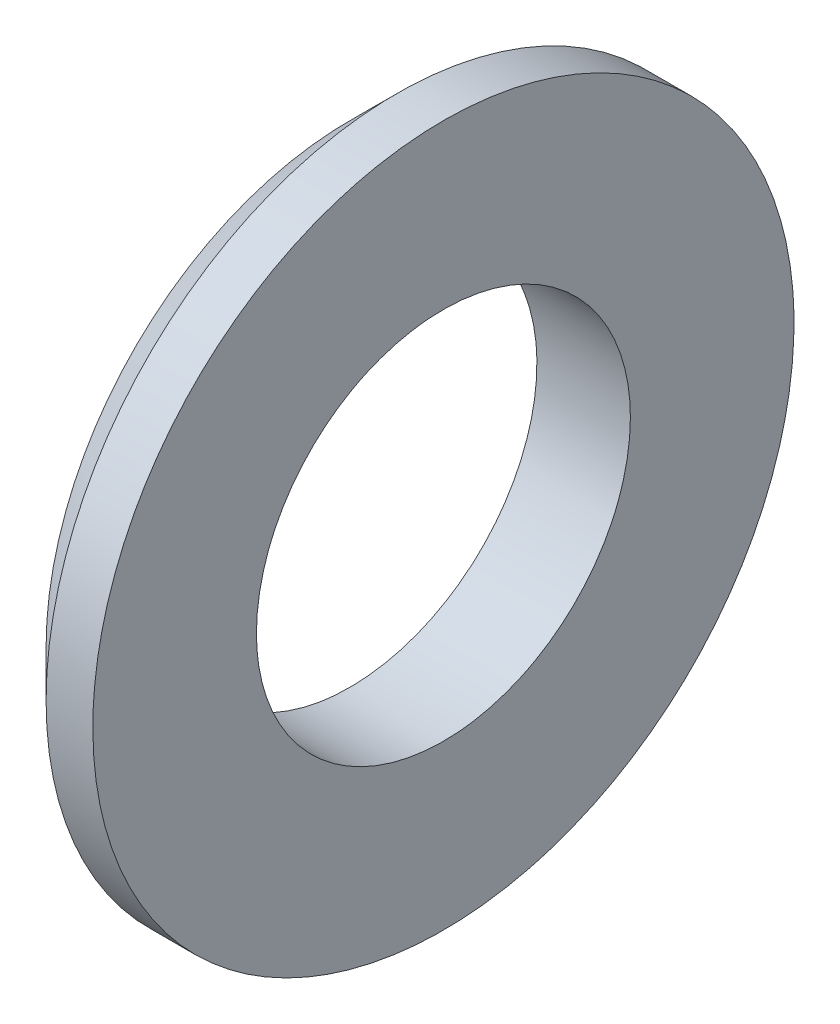
ISO-10303-21;
HEADER;
FILE_DESCRIPTION(('STEP AP214'),'2;1');
FILE_NAME('part.step','',(''),(''),'','','');
FILE_SCHEMA(('AUTOMOTIVE_DESIGN { 1 0 10303 214 1 1 1 1 }'));
ENDSEC;
DATA;
#1=APPLICATION_CONTEXT('core data for automotive mechanical design processes');
#2=APPLICATION_PROTOCOL_DEFINITION('international standard','automotive_design',2000,#1);
#3=PRODUCT_CONTEXT('',#1,'mechanical');
#4=PRODUCT('Part','Part','',(#3));
#5=PRODUCT_RELATED_PRODUCT_CATEGORY('part','',(#4));
#6=PRODUCT_DEFINITION_FORMATION('','',#4);
#7=PRODUCT_DEFINITION_CONTEXT('part definition',#1,'design');
#8=PRODUCT_DEFINITION('design','',#6,#7);
#9=PRODUCT_DEFINITION_SHAPE('','',#8);
#10=(LENGTH_UNIT() NAMED_UNIT(*) SI_UNIT(.MILLI.,.METRE.));
#11=(NAMED_UNIT(*) PLANE_ANGLE_UNIT() SI_UNIT($,.RADIAN.));
#12=(NAMED_UNIT(*) SI_UNIT($,.STERADIAN.) SOLID_ANGLE_UNIT());
#13=UNCERTAINTY_MEASURE_WITH_UNIT(LENGTH_MEASURE(1.E-05),#10,'distance_accuracy_value','');
#14=(GEOMETRIC_REPRESENTATION_CONTEXT(3) GLOBAL_UNCERTAINTY_ASSIGNED_CONTEXT((#13)) GLOBAL_UNIT_ASSIGNED_CONTEXT((#10,
#11,#12)) REPRESENTATION_CONTEXT('',''));
#15=CARTESIAN_POINT('',(0.,0.,0.));
#16=DIRECTION('',(0.,0.,1.));
#17=DIRECTION('',(1.,0.,0.));
#18=AXIS2_PLACEMENT_3D('',#15,#16,#17);
#19=CARTESIAN_POINT('',(0.,0.,5.2));
#20=CARTESIAN_POINT('',(0.8,0.,6.));
#21=(BOUNDED_CURVE() B_SPLINE_CURVE(1,(#19,#20),.UNSPECIFIED.,.F.,
.F.) B_SPLINE_CURVE_WITH_KNOTS((2,2),(0.,1.),
.UNSPECIFIED.) CURVE() GEOMETRIC_REPRESENTATION_ITEM() RATIONAL_B_SPLINE_CURVE((1.,1.)) REPRESENTATION_ITEM(''));
#22=CARTESIAN_POINT('',(-999.2,0.,0.));
#23=DIRECTION('',(1.,0.,0.));
#24=AXIS1_PLACEMENT('',#22,#23);
#25=SURFACE_OF_REVOLUTION('',#21,#24);
#26=CARTESIAN_POINT('',(0.800000000000023,0.,0.));
#27=DIRECTION('',(-1.,0.,0.));
#28=DIRECTION('',(0.,0.,1.));
#29=AXIS2_PLACEMENT_3D('',#26,#27,#28);
#30=CIRCLE('',#29,6.);
#31=CARTESIAN_POINT('',(0.8,0.,6.));
#32=VERTEX_POINT('',#31);
#33=EDGE_CURVE('E56',#32,#32,#30,.F.);
#34=ORIENTED_EDGE('',*,*,#33,.F.);
#35=EDGE_LOOP('',(#34));
#36=FACE_BOUND('',#35,.T.);
#37=CARTESIAN_POINT('',(0.,0.,0.));
#38=DIRECTION('',(-1.,0.,0.));
#39=DIRECTION('',(0.,0.,1.));
#40=AXIS2_PLACEMENT_3D('',#37,#38,#39);
#41=CIRCLE('',#40,5.2);
#42=CARTESIAN_POINT('',(0.,0.,5.2));
#43=VERTEX_POINT('',#42);
#44=EDGE_CURVE('E109',#43,#43,#41,.F.);
#45=ORIENTED_EDGE('',*,*,#44,.T.);
#46=EDGE_LOOP('',(#45));
#47=FACE_BOUND('',#46,.T.);
#48=ADVANCED_FACE('F51',(#36,#47),#25,.T.);
#49=CARTESIAN_POINT('',(0.8,0.,6.));
#50=CARTESIAN_POINT('',(1.6,0.,6.));
#51=(BOUNDED_CURVE() B_SPLINE_CURVE(1,(#49,#50),.UNSPECIFIED.,.F.,
.F.) B_SPLINE_CURVE_WITH_KNOTS((2,2),(0.,1.),
.UNSPECIFIED.) CURVE() GEOMETRIC_REPRESENTATION_ITEM() RATIONAL_B_SPLINE_CURVE((1.,1.)) REPRESENTATION_ITEM(''));
#52=CARTESIAN_POINT('',(0.,0.,0.));
#53=DIRECTION('',(1.,0.,0.));
#54=AXIS1_PLACEMENT('',#52,#53);
#55=SURFACE_OF_REVOLUTION('',#51,#54);
#56=ORIENTED_EDGE('',*,*,#33,.T.);
#57=EDGE_LOOP('',(#56));
#58=FACE_BOUND('',#57,.T.);
#59=CARTESIAN_POINT('',(1.6,-3.59170164361853E-10,6.));
#60=CARTESIAN_POINT('',(1.6,-0.26968095314783,5.99999418190786));
#61=CARTESIAN_POINT('',(1.6,-0.539478358188806,5.98178535260379));
#62=CARTESIAN_POINT('',(1.6,-1.07451641210655,5.90917848538037));
#63=CARTESIAN_POINT('',(1.6,-1.33975075115284,5.85473391311402));
#64=CARTESIAN_POINT('',(1.6,-1.76256270022421,5.73775804767826));
#65=CARTESIAN_POINT('',(1.6,-1.9231803274527,5.68593304659074));
#66=CARTESIAN_POINT('',(1.6,-2.2395305465287,5.56892537873634));
#67=CARTESIAN_POINT('',(1.6,-2.39526236335028,5.50374060496664));
#68=CARTESIAN_POINT('',(1.6,-2.7006886216708,5.36047973336366));
#69=CARTESIAN_POINT('',(1.6,-2.85038251993142,5.28240247878424));
#70=CARTESIAN_POINT('',(1.6,-3.14271531515376,5.11388427856295));
#71=CARTESIAN_POINT('',(1.6,-3.28535165406967,5.02343889409568));
#72=CARTESIAN_POINT('',(1.6,-3.5624252446705,4.83089779344028));
#73=CARTESIAN_POINT('',(1.6,-3.69686654902699,4.72880790868914));
#74=CARTESIAN_POINT('',(1.6,-3.95672043816997,4.51362717266514));
#75=CARTESIAN_POINT('',(1.6,-4.08212967746626,4.40053228121846));
#76=CARTESIAN_POINT('',(1.6,-4.32291860112681,4.16423061334616));
#77=CARTESIAN_POINT('',(1.6,-4.43830275316045,4.04102838933053));
#78=CARTESIAN_POINT('',(1.6,-4.65832524504454,3.78529635898459));
#79=CARTESIAN_POINT('',(1.6,-4.7629596026545,3.6527631264218));
#80=CARTESIAN_POINT('',(1.6,-4.9606564214362,3.37939809323381));
#81=CARTESIAN_POINT('',(1.6,-5.05372276479612,3.23856910015163));
#82=CARTESIAN_POINT('',(1.6,-5.22769542700006,2.94951945522944));
#83=CARTESIAN_POINT('',(1.6,-5.30859724340712,2.80129609342423));
#84=CARTESIAN_POINT('',(1.6,-5.45759781399371,2.49861371614285));
#85=CARTESIAN_POINT('',(1.6,-5.52570110273952,2.34415693284182));
#86=CARTESIAN_POINT('',(1.6,-5.64867893546045,2.02999793018249));
#87=CARTESIAN_POINT('',(1.6,-5.70354858275821,1.87029379397168));
#88=CARTESIAN_POINT('',(1.6,-5.79961812957173,1.54689153790312));
#89=CARTESIAN_POINT('',(1.6,-5.84082319549598,1.3831949527292));
#90=CARTESIAN_POINT('',(1.6,-5.90931213289774,1.05285097630758));
#91=CARTESIAN_POINT('',(1.6,-5.93659078832452,0.886202503593339));
#92=CARTESIAN_POINT('',(1.6,-5.97700124271102,0.551269208436597));
#93=CARTESIAN_POINT('',(1.6,-5.99013889630438,0.38298509232115));
#94=CARTESIAN_POINT('',(1.6,-6.00219682526369,0.0458318231667442));
#95=CARTESIAN_POINT('',(1.6,-6.00111065533081,-0.12303756042529));
#96=CARTESIAN_POINT('',(1.6,-5.98471302840039,-0.460083887052308));
#97=CARTESIAN_POINT('',(1.6,-5.96940160225738,-0.628260831588397));
#98=CARTESIAN_POINT('',(1.6,-5.92467258235549,-0.962650635694363));
#99=CARTESIAN_POINT('',(1.6,-5.89526138105391,-1.1288643503834));
#100=CARTESIAN_POINT('',(1.6,-5.82252919483873,-1.45829316791027));
#101=CARTESIAN_POINT('',(1.6,-5.77920239125474,-1.62150698613563));
#102=CARTESIAN_POINT('',(1.6,-5.67896954305696,-1.94364321093796));
#103=CARTESIAN_POINT('',(1.6,-5.62206858479042,-2.10256720017881));
#104=CARTESIAN_POINT('',(1.6,-5.49505796725162,-2.41511995480573));
#105=CARTESIAN_POINT('',(1.6,-5.42494307752962,-2.56874659476722));
#106=CARTESIAN_POINT('',(1.6,-5.27204633829621,-2.86949001663107));
#107=CARTESIAN_POINT('',(1.6,-5.18926917669415,-3.01660918189265));
#108=CARTESIAN_POINT('',(1.6,-5.01158927766852,-3.30339768494254));
#109=CARTESIAN_POINT('',(1.6,-4.91668273121635,-3.44306466288303));
#110=CARTESIAN_POINT('',(1.6,-4.71547660508139,-3.71385552138702));
#111=CARTESIAN_POINT('',(1.6,-4.6091812439159,-3.84498253648888));
#112=CARTESIAN_POINT('',(1.6,-4.38589737351381,-4.09784823521063));
#113=CARTESIAN_POINT('',(1.6,-4.26890631606382,-4.21958466875232));
#114=CARTESIAN_POINT('',(1.6,-4.02512952864556,-4.45272583136818));
#115=CARTESIAN_POINT('',(1.6,-3.89834742788019,-4.56413435526958));
#116=CARTESIAN_POINT('',(1.6,-3.63576155073899,-4.77595139976924));
#117=CARTESIAN_POINT('',(1.6,-3.49995166190058,-4.87635234304189));
#118=CARTESIAN_POINT('',(1.6,-3.22040576804697,-5.06531733652102));
#119=CARTESIAN_POINT('',(1.6,-3.07667270372441,-5.15388573715342));
#120=CARTESIAN_POINT('',(1.6,-2.78211786340608,-5.31867713519572));
#121=CARTESIAN_POINT('',(1.6,-2.63128955109556,-5.39488844979913));
#122=CARTESIAN_POINT('',(1.6,-2.32380096382398,-5.53429624040361));
#123=CARTESIAN_POINT('',(1.6,-2.16714286003786,-5.59749750554603));
#124=CARTESIAN_POINT('',(1.6,-1.84923084035951,-5.71040868151002));
#125=CARTESIAN_POINT('',(1.6,-1.68798215433273,-5.76013331557612));
#126=CARTESIAN_POINT('',(1.6,-1.36193075528332,-5.84581478206233));
#127=CARTESIAN_POINT('',(1.6,-1.19712930608762,-5.88177642773795));
#128=CARTESIAN_POINT('',(1.6,-0.860929769514175,-5.94042345690064));
#129=CARTESIAN_POINT('',(1.6,-0.689469698420019,-5.9627550902537));
#130=CARTESIAN_POINT('',(1.6,-0.345355347366082,-5.99254235955611));
#131=CARTESIAN_POINT('',(1.6,-0.17270155315804,-6.00000372580268));
#132=CARTESIAN_POINT('',(1.6,0.26968095114671,-5.99999418199774));
#133=CARTESIAN_POINT('',(1.6,0.539478356193441,-5.9817853527837));
#134=CARTESIAN_POINT('',(1.6,1.07451641013565,-5.90917848573881));
#135=CARTESIAN_POINT('',(1.6,1.33975074920065,-5.85473391356078));
#136=CARTESIAN_POINT('',(1.6,1.7625626983117,-5.73775804826575));
#137=CARTESIAN_POINT('',(1.6,1.92318032555757,-5.68593304723174));
#138=CARTESIAN_POINT('',(1.6,2.23953054467277,-5.56892537948271));
#139=CARTESIAN_POINT('',(1.6,2.39526236151617,-5.50374060576486));
#140=CARTESIAN_POINT('',(1.6,2.70068861988443,-5.36047973426366));
#141=CARTESIAN_POINT('',(1.6,2.85038251817098,-5.28240247973417));
#142=CARTESIAN_POINT('',(1.6,3.14271531344931,-5.11388427961041));
#143=CARTESIAN_POINT('',(1.6,3.28535165239528,-5.02343889519074));
#144=CARTESIAN_POINT('',(1.6,3.56242524306018,-4.83089779462776));
#145=CARTESIAN_POINT('',(1.6,3.69686654745069,-4.72880790992145));
#146=CARTESIAN_POINT('',(1.6,3.95672043666537,-4.5136271739841));
#147=CARTESIAN_POINT('',(1.6,4.08212967599935,-4.40053228257924));
#148=CARTESIAN_POINT('',(1.6,4.32291859973867,-4.16423061478721));
#149=CARTESIAN_POINT('',(1.6,4.43830275181339,-4.04102839081003));
#150=CARTESIAN_POINT('',(1.6,4.65832524378275,-3.78529636053739));
#151=CARTESIAN_POINT('',(1.6,4.7629596014369,-3.65276312800947));
#152=CARTESIAN_POINT('',(1.6,4.96065642030974,-3.37939809488736));
#153=CARTESIAN_POINT('',(1.6,5.0537227637166,-3.2385691018362));
#154=CARTESIAN_POINT('',(1.6,5.2276954260169,-2.949519456972));
#155=CARTESIAN_POINT('',(1.6,5.30859724247336,-2.80129609519375));
#156=CARTESIAN_POINT('',(1.6,5.45759781316085,-2.49861371796204));
#157=CARTESIAN_POINT('',(1.6,5.52570110195814,-2.34415693468371));
#158=CARTESIAN_POINT('',(1.6,5.64867893478379,-2.02999793206538));
#159=CARTESIAN_POINT('',(1.6,5.70354858213478,-1.87029379587285));
#160=CARTESIAN_POINT('',(1.6,5.7996181290561,-1.54689153983632));
#161=CARTESIAN_POINT('',(1.6,5.84082319503491,-1.38319495467614));
#162=CARTESIAN_POINT('',(1.6,5.90931213254679,-1.05285097827735));
#163=CARTESIAN_POINT('',(1.6,5.93659078802911,-0.8862025055722));
#164=CARTESIAN_POINT('',(1.6,5.97700124252726,-0.551269210428928));
#165=CARTESIAN_POINT('',(1.6,5.99013889617672,-0.38298509431786));
#166=CARTESIAN_POINT('',(1.6,6.00219682524842,-0.0458318251674741));
#167=CARTESIAN_POINT('',(1.6,6.00111065537183,0.123037558424922));
#168=CARTESIAN_POINT('',(1.6,5.98471302855375,0.46008388505741));
#169=CARTESIAN_POINT('',(1.6,5.9694016024668,0.628260829598606));
#170=CARTESIAN_POINT('',(1.6,5.92467258267637,0.962650633719489));
#171=CARTESIAN_POINT('',(1.6,5.89526138143019,1.12886434841833));
#172=CARTESIAN_POINT('',(1.6,5.82252919532482,1.45829316596945));
#173=CARTESIAN_POINT('',(1.6,5.77920239179524,1.62150698420925));
#174=CARTESIAN_POINT('',(1.6,5.67896954370484,1.94364320904498));
#175=CARTESIAN_POINT('',(1.6,5.62206858549127,2.1025671983048));
#176=CARTESIAN_POINT('',(1.6,5.49505796805666,2.41511995297403));
#177=CARTESIAN_POINT('',(1.6,5.42494307838588,2.56874659295886));
#178=CARTESIAN_POINT('',(1.6,5.27204633925275,2.86949001487365));
#179=CARTESIAN_POINT('',(1.6,5.18926917769974,3.0166091801628));
#180=CARTESIAN_POINT('',(1.6,5.01158927876972,3.30339768327192));
#181=CARTESIAN_POINT('',(1.6,4.91668273236409,3.44306466124407));
#182=CARTESIAN_POINT('',(1.6,4.71547660631937,3.71385551981516));
#183=CARTESIAN_POINT('',(1.6,4.60918124519757,3.84498253495247));
#184=CARTESIAN_POINT('',(1.6,4.38589737487967,4.09784823374876));
#185=CARTESIAN_POINT('',(1.6,4.26890631747017,4.21958466732953));
#186=CARTESIAN_POINT('',(1.6,4.02512953012944,4.45272583002681));
#187=CARTESIAN_POINT('',(1.6,3.89834742940111,4.56413435397053));
#188=CARTESIAN_POINT('',(1.6,3.63576155233049,4.77595139855768));
#189=CARTESIAN_POINT('',(1.6,3.49995166352564,4.87635234187552));
#190=CARTESIAN_POINT('',(1.6,3.2204057697352,5.06531733544768));
#191=CARTESIAN_POINT('',(1.6,3.07667270544227,5.15388573612792));
#192=CARTESIAN_POINT('',(1.6,2.78211786517943,5.31867713426809));
#193=CARTESIAN_POINT('',(1.6,2.6312895528948,5.39488844892156));
#194=CARTESIAN_POINT('',(1.6,2.32380096567069,5.53429623962818));
#195=CARTESIAN_POINT('',(1.6,2.16714286190615,5.59749750482269));
#196=CARTESIAN_POINT('',(1.6,1.84923084226558,5.71040868089278));
#197=CARTESIAN_POINT('',(1.6,1.68798215625497,5.76013331501281));
#198=CARTESIAN_POINT('',(1.6,1.36193075723323,5.84581478160808));
#199=CARTESIAN_POINT('',(1.6,1.19712930804903,5.88177642733878));
#200=CARTESIAN_POINT('',(1.6,0.860929770837556,5.94042345672821));
#201=CARTESIAN_POINT('',(1.6,0.689469699083808,5.96275509019626));
#202=CARTESIAN_POINT('',(1.6,0.345355346701393,5.99254235961364));
#203=CARTESIAN_POINT('',(1.6,0.172701551824469,6.00000372586025));
#204=CARTESIAN_POINT('',(1.6,-3.59170164361853E-10,6.));
#205=B_SPLINE_CURVE_WITH_KNOTS('',3,(#59,#60,#61,#62,#63,#64,#65,#66,#67,#68,#69,#70,#71,#72,
#73,#74,#75,#76,#77,#78,#79,#80,#81,#82,#83,#84,#85,#86,#87,#88,#89,#90,#91,#92,#93,#94,#95,#96,
#97,#98,#99,#100,#101,#102,#103,#104,#105,#106,#107,#108,#109,#110,#111,#112,#113,#114,#115,
#116,#117,#118,#119,#120,#121,#122,#123,#124,#125,#126,#127,#128,#129,#130,#131,#132,#133,#134,
#135,#136,#137,#138,#139,#140,#141,#142,#143,#144,#145,#146,#147,#148,#149,#150,#151,#152,#153,
#154,#155,#156,#157,#158,#159,#160,#161,#162,#163,#164,#165,#166,#167,#168,#169,#170,#171,#172,
#173,#174,#175,#176,#177,#178,#179,#180,#181,#182,#183,#184,#185,#186,#187,#188,#189,#190,#191,
#192,#193,#194,#195,#196,#197,#198,#199,#200,#201,#202,#203,#204),.UNSPECIFIED.,.T.,.F.,(4,2,2,
2,2,2,2,2,2,2,2,2,2,2,2,2,2,2,2,2,2,2,2,2,2,2,2,2,2,2,2,2,2,2,2,2,2,2,2,2,2,2,2,2,2,2,2,2,2,2,2,
2,2,2,2,2,2,2,2,2,2,2,2,2,2,2,2,2,2,2,2,2,4),(0.,0.808663640157875,1.618367784214,
2.12414327508747,2.62999859453184,3.13589932528701,3.64198209872925,4.14781253513256,
4.65382937841629,5.15961954662002,5.66559641326993,6.17140301461206,6.67739637092618,
7.18321011250801,7.68921072781318,8.19501981187124,8.70101820485431,9.20680702456421,
9.71282504234017,10.2188419625669,10.7246296850336,11.2306291735367,11.7364393568672,
12.242450176369,12.7482741086235,13.2542572784614,13.7600536714091,14.2659708842363,
14.7717014628101,15.2777780155255,15.7836679859079,16.2900334875426,16.7962122558571,
17.3018357731367,17.8072822994983,18.3253437807151,18.8432055869232,19.6518692270792,
20.4615733711372,20.967348862011,21.4732041814557,21.9791049122106,22.4851876856525,
22.9910181220557,23.4970349653394,24.0028251335432,24.5088020001932,25.0146086015353,
25.5206019578495,26.0264156994313,26.5324163147364,27.0382253987945,27.5442237917776,
28.0500126114875,28.5560306292634,29.0620475494902,29.5678352719569,30.07383476046,
30.5796449437904,31.0856557632922,31.5914796955466,32.0974628653845,32.6032592583324,
33.1091764711599,33.6149070497341,34.1209836024491,34.6268735728312,35.1332390744643,
35.6394178427772,36.145041360058,36.6504878864216,37.1685493696372,37.6864111778428),.UNSPECIFIED.);
#206=CARTESIAN_POINT('',(1.6,-3.59170164361853E-10,6.));
#207=VERTEX_POINT('',#206);
#208=EDGE_CURVE('E65',#207,#207,#205,.T.);
#209=ORIENTED_EDGE('',*,*,#208,.F.);
#210=EDGE_LOOP('',(#209));
#211=FACE_BOUND('',#210,.T.);
#212=ADVANCED_FACE('F86',(#58,#211),#55,.T.);
#213=CARTESIAN_POINT('',(0.,-5.2624,5.2624));
#214=DIRECTION('',(-1.,0.,0.));
#215=DIRECTION('',(0.,0.,-1.));
#216=AXIS2_PLACEMENT_3D('',#213,#214,#215);
#217=PLANE('',#216);
#218=CARTESIAN_POINT('',(0.,-1.91557420992988E-10,3.2));
#219=CARTESIAN_POINT('',(0.,-0.089845964986707,3.19999946157711));
#220=CARTESIAN_POINT('',(0.,-0.179708441404551,3.19621272757599));
#221=CARTESIAN_POINT('',(0.,-0.358812389552788,3.18109041069085));
#222=CARTESIAN_POINT('',(0.,-0.448053670081112,3.16975259915016));
#223=CARTESIAN_POINT('',(0.,-0.625414101327529,3.1395791364016));
#224=CARTESIAN_POINT('',(0.,-0.713531240540526,3.1207315832284));
#225=CARTESIAN_POINT('',(0.,-0.887913522848521,3.07566855660641));
#226=CARTESIAN_POINT('',(0.,-0.974177101632721,3.04944710404263));
#227=CARTESIAN_POINT('',(0.,-1.22889409111843,2.96008442313228));
#228=CARTESIAN_POINT('',(0.,-1.39370242213017,2.88617147047747));
#229=CARTESIAN_POINT('',(0.,-1.70855258164091,2.71168650303886));
#230=CARTESIAN_POINT('',(0.,-1.85859384850507,2.61111347483094));
#231=CARTESIAN_POINT('',(0.,-2.06932057923381,2.44254853488555));
#232=CARTESIAN_POINT('',(0.,-2.13721332378828,2.38336481773535));
#233=CARTESIAN_POINT('',(0.,-2.26772492966973,2.2595350313063));
#234=CARTESIAN_POINT('',(0.,-2.33034881270231,2.19489428357399));
#235=CARTESIAN_POINT('',(0.,-2.44995585090148,2.06053605003234));
#236=CARTESIAN_POINT('',(0.,-2.50693643801514,1.99081627776759));
#237=CARTESIAN_POINT('',(0.,-2.61482744355101,1.84683075488405));
#238=CARTESIAN_POINT('',(0.,-2.66573645299682,1.77256395510529));
#239=CARTESIAN_POINT('',(0.,-2.80875394640783,1.54375281459574));
#240=CARTESIAN_POINT('',(0.,-2.89127906356545,1.38305574192639));
#241=CARTESIAN_POINT('',(0.,-3.02812898167749,1.05017429095425));
#242=CARTESIAN_POINT('',(0.,-3.08245408382124,0.877990035362125));
#243=CARTESIAN_POINT('',(0.,-3.16144052373424,0.5269228194254));
#244=CARTESIAN_POINT('',(0.,-3.18610170308556,0.348039823311946));
#245=CARTESIAN_POINT('',(0.,-3.20503470734791,-0.0113272110865404));
#246=CARTESIAN_POINT('',(0.,-3.19930653225895,-0.191811249371573));
#247=CARTESIAN_POINT('',(0.,-3.15764643139749,-0.549234645069032));
#248=CARTESIAN_POINT('',(0.,-3.12171466692443,-0.726174021406227));
#249=CARTESIAN_POINT('',(0.,-3.02060050973804,-1.07159244550238));
#250=CARTESIAN_POINT('',(0.,-2.95541780460866,-1.24007140287806));
#251=CARTESIAN_POINT('',(0.,-2.83723482291628,-1.48264371020343));
#252=CARTESIAN_POINT('',(0.,-2.79441137092613,-1.56184874004235));
#253=CARTESIAN_POINT('',(0.,-2.70224720170133,-1.7163740317803));
#254=CARTESIAN_POINT('',(0.,-2.65290799588566,-1.79169518898031));
#255=CARTESIAN_POINT('',(0.,-2.54808104652755,-1.93787757230841));
#256=CARTESIAN_POINT('',(0.,-2.49259609707533,-2.00874080239109));
#257=CARTESIAN_POINT('',(0.,-2.37581864944673,-2.14559884198745));
#258=CARTESIAN_POINT('',(0.,-2.31452059819251,-2.21158888707976));
#259=CARTESIAN_POINT('',(0.,-2.12267272336283,-2.40136319236304));
#260=CARTESIAN_POINT('',(0.,-1.98402997958468,-2.51714533849441));
#261=CARTESIAN_POINT('',(0.,-1.68925715215087,-2.72374787239141));
#262=CARTESIAN_POINT('',(0.,-1.5331277335084,-2.81456920895607));
#263=CARTESIAN_POINT('',(0.,-1.28921079294775,-2.93020207443899));
#264=CARTESIAN_POINT('',(0.,-1.20618003199,-2.96534268248769));
#265=CARTESIAN_POINT('',(0.,-1.03749819990082,-3.02847980528005));
#266=CARTESIAN_POINT('',(0.,-0.951849312687562,-3.05648210166587));
#267=CARTESIAN_POINT('',(0.,-0.778641268240398,-3.10512502268191));
#268=CARTESIAN_POINT('',(0.,-0.69108536199849,-3.12577727202647));
#269=CARTESIAN_POINT('',(0.,-0.514561923876429,-3.15963557239238));
#270=CARTESIAN_POINT('',(0.,-0.425594816320349,-3.17284381964183));
#271=CARTESIAN_POINT('',(0.,-0.280408181089026,-3.18818539502755));
#272=CARTESIAN_POINT('',(0.,-0.224421107487565,-3.19261446982878));
#273=CARTESIAN_POINT('',(0.,-0.112291505803032,-3.19852194054856));
#274=CARTESIAN_POINT('',(0.,-0.0561489777199612,-3.20000033646712));
#275=CARTESIAN_POINT('',(0.,0.0898459639196159,-3.19999946160706));
#276=CARTESIAN_POINT('',(0.,0.179708440338472,-3.19621272763592));
#277=CARTESIAN_POINT('',(0.,0.358812388491312,-3.18109041081058));
#278=CARTESIAN_POINT('',(0.,0.448053669023225,-3.16975259929969));
#279=CARTESIAN_POINT('',(0.,0.625414100279794,-3.13957913661032));
#280=CARTESIAN_POINT('',(0.,0.713531239499351,-3.12073158346646));
#281=CARTESIAN_POINT('',(0.,0.887913521822863,-3.07566855690251));
#282=CARTESIAN_POINT('',(0.,0.974177100616024,-3.04944710436743));
#283=CARTESIAN_POINT('',(0.,1.22889409013172,-2.96008442354192));
#284=CARTESIAN_POINT('',(0.,1.3937024211681,-2.88617147094205));
#285=CARTESIAN_POINT('',(0.,1.708552580737,-2.71168650360839));
#286=CARTESIAN_POINT('',(0.,1.85859384763469,-2.61111347545048));
#287=CARTESIAN_POINT('',(0.,2.06932057841962,-2.44254853557533));
#288=CARTESIAN_POINT('',(0.,2.1372133229938,-2.38336481844777));
#289=CARTESIAN_POINT('',(0.,2.26772492891651,-2.25953503206225));
#290=CARTESIAN_POINT('',(0.,2.33034881197063,-2.19489428435083));
#291=CARTESIAN_POINT('',(0.,2.44995585021459,-2.06053605084905));
#292=CARTESIAN_POINT('',(0.,2.5069364373515,-1.99081627860328));
#293=CARTESIAN_POINT('',(0.,2.61482744293538,-1.84683075575569));
#294=CARTESIAN_POINT('',(0.,2.66573645240596,-1.77256395599388));
#295=CARTESIAN_POINT('',(0.,2.80875394589325,-1.54375281553199));
#296=CARTESIAN_POINT('',(0.,2.89127906310444,-1.38305574289014));
#297=CARTESIAN_POINT('',(0.,3.02812898132743,-1.05017429196362));
#298=CARTESIAN_POINT('',(0.,3.08245408352858,-0.877990036389604));
#299=CARTESIAN_POINT('',(0.,3.1614405235586,-0.526922820479214));
#300=CARTESIAN_POINT('',(0.,3.18610170296954,-0.348039824373981));
#301=CARTESIAN_POINT('',(0.,3.20503470735168,0.0113272100181944));
#302=CARTESIAN_POINT('',(0.,3.19930653232289,0.191811248305138));
#303=CARTESIAN_POINT('',(0.,3.15764643158057,0.549234644016491));
#304=CARTESIAN_POINT('',(0.,3.12171466716649,0.726174020365668));
#305=CARTESIAN_POINT('',(0.,3.02060051009523,1.07159244449552));
#306=CARTESIAN_POINT('',(0.,2.95541780502201,1.24007140189293));
#307=CARTESIAN_POINT('',(0.,2.8372348234105,1.48264370925768));
#308=CARTESIAN_POINT('',(0.,2.79441137144676,1.56184873911085));
#309=CARTESIAN_POINT('',(0.,2.70224720227348,1.71637403087951));
#310=CARTESIAN_POINT('',(0.,2.65290799648293,1.79169518809595));
#311=CARTESIAN_POINT('',(0.,2.54808104717355,1.93787757145899));
#312=CARTESIAN_POINT('',(0.,2.49259609774494,2.00874080156018));
#313=CARTESIAN_POINT('',(0.,2.37581865016195,2.14559884119549));
#314=CARTESIAN_POINT('',(0.,2.31452059892971,2.21158888630824));
#315=CARTESIAN_POINT('',(0.,2.12267272416329,2.40136319165548));
#316=CARTESIAN_POINT('',(0.,1.98402998042375,2.51714533783305));
#317=CARTESIAN_POINT('',(0.,1.6892571530588,2.72374787182831));
#318=CARTESIAN_POINT('',(0.,1.5331277344466,2.81456920844502));
#319=CARTESIAN_POINT('',(0.,1.28921079392468,2.93020207400916));
#320=CARTESIAN_POINT('',(0.,1.20618003297887,2.96534268208545));
#321=CARTESIAN_POINT('',(0.,1.03749820091122,3.0284798049339));
#322=CARTESIAN_POINT('',(0.,0.951849313707563,3.05648210134821));
#323=CARTESIAN_POINT('',(0.,0.778641269276715,3.10512502242205));
#324=CARTESIAN_POINT('',(0.,0.691085363041508,3.12577727179587));
#325=CARTESIAN_POINT('',(0.,0.514561924930307,3.15963557222076));
#326=CARTESIAN_POINT('',(0.,0.425594817378384,3.17284381949992));
#327=CARTESIAN_POINT('',(0.,0.280408181798157,3.18818539497145));
#328=CARTESIAN_POINT('',(0.,0.224421107842622,3.19261446981008));
#329=CARTESIAN_POINT('',(0.,0.112291505447973,3.19852194056727));
#330=CARTESIAN_POINT('',(0.,0.0561489770088588,3.20000033648583));
#331=CARTESIAN_POINT('',(0.,-1.91557420992988E-10,3.2));
#332=B_SPLINE_CURVE_WITH_KNOTS('',3,(#218,#219,#220,#221,#222,#223,#224,#225,#226,#227,#228,
#229,#230,#231,#232,#233,#234,#235,#236,#237,#238,#239,#240,#241,#242,#243,#244,#245,#246,#247,
#248,#249,#250,#251,#252,#253,#254,#255,#256,#257,#258,#259,#260,#261,#262,#263,#264,#265,#266,
#267,#268,#269,#270,#271,#272,#273,#274,#275,#276,#277,#278,#279,#280,#281,#282,#283,#284,#285,
#286,#287,#288,#289,#290,#291,#292,#293,#294,#295,#296,#297,#298,#299,#300,#301,#302,#303,#304,
#305,#306,#307,#308,#309,#310,#311,#312,#313,#314,#315,#316,#317,#318,#319,#320,#321,#322,#323,
#324,#325,#326,#327,#328,#329,#330,#331),.UNSPECIFIED.,.T.,.F.,(4,2,2,2,2,2,2,2,2,2,2,2,2,2,2,2,
2,2,2,2,2,2,2,2,2,2,2,2,2,2,2,2,2,2,2,2,2,2,2,2,2,2,2,2,2,2,2,2,2,2,2,2,2,2,2,2,4),(0.,
0.269486203930179,0.539051980415856,0.80904669391214,1.07926096659492,1.61840143244712,
2.15756239547763,2.42749612813386,2.69716960401562,2.96696523972049,3.23682336314686,
3.77597695685429,4.31512479203085,4.8542755064729,5.39342622091495,5.93257405609149,
6.47172764979894,6.74158577322535,7.01138140893026,7.28105488481198,7.55098861746817,
8.09014958049871,8.62929004635087,8.89950431903434,9.16949903253144,9.43906480901659,
9.7085510129458,9.87696563967945,10.0453802664131,10.3148664703423,10.5844322468275,
10.8544269603246,11.124641233008,11.6637816988602,12.2029426618907,12.4728763945469,
12.7425498704286,13.0123455061335,13.28220362956,13.8213572232674,14.3605050584439,
14.899655772886,15.438806487328,15.9779543225046,16.517107916212,16.7869660396384,
17.0567616753433,17.326435151225,17.5963688838813,18.1355298469118,18.674670312764,
18.9448845854468,19.214879298943,19.4844450754287,19.7539312793589,19.9223459071588,
20.0907605349588),.UNSPECIFIED.);
#333=CARTESIAN_POINT('',(0.,-1.91557420992988E-10,3.2));
#334=VERTEX_POINT('',#333);
#335=EDGE_CURVE('E60',#334,#334,#332,.T.);
#336=ORIENTED_EDGE('',*,*,#335,.T.);
#337=EDGE_LOOP('',(#336));
#338=FACE_BOUND('',#337,.T.);
#339=ORIENTED_EDGE('',*,*,#44,.F.);
#340=EDGE_LOOP('',(#339));
#341=FACE_BOUND('',#340,.T.);
#342=ADVANCED_FACE('F103',(#338,#341),#217,.T.);
#343=CARTESIAN_POINT('',(1.6,-6.072,6.072));
#344=DIRECTION('',(-1.,0.,0.));
#345=DIRECTION('',(0.,0.,-1.));
#346=AXIS2_PLACEMENT_3D('',#343,#344,#345);
#347=PLANE('',#346);
#348=CARTESIAN_POINT('',(1.6,-8.75108304731578E-10,-3.2));
#349=CARTESIAN_POINT('',(1.6,-0.0898459656702578,-3.19999946155792));
#350=CARTESIAN_POINT('',(1.6,-0.179708442087293,-3.1962127275376));
#351=CARTESIAN_POINT('',(1.6,-0.3588123902323,-3.1810904106142));
#352=CARTESIAN_POINT('',(1.6,-0.448053670758202,-3.16975259905445));
#353=CARTESIAN_POINT('',(1.6,-0.625414101998174,-3.13957913626801));
#354=CARTESIAN_POINT('',(1.6,-0.713531241207145,-3.12073158307598));
#355=CARTESIAN_POINT('',(1.6,-0.887913523505513,-3.07566855641674));
#356=CARTESIAN_POINT('',(1.6,-0.974177102284112,-3.04944710383453));
#357=CARTESIAN_POINT('',(1.6,-1.22889409175073,-2.96008442286978));
#358=CARTESIAN_POINT('',(1.6,-1.39370242274669,-2.88617147017976));
#359=CARTESIAN_POINT('',(1.6,-1.70855258222015,-2.7116865026739));
#360=CARTESIAN_POINT('',(1.6,-1.85859384906283,-2.61111347443393));
#361=CARTESIAN_POINT('',(1.6,-2.06932057975556,-2.44254853444352));
#362=CARTESIAN_POINT('',(1.6,-2.13721332429739,-2.38336481727882));
#363=CARTESIAN_POINT('',(1.6,-2.26772493015239,-2.25953503082189));
#364=CARTESIAN_POINT('',(1.6,-2.33034881317116,-2.19489428307621));
#365=CARTESIAN_POINT('',(1.6,-2.44995585134163,-2.06053604950901));
#366=CARTESIAN_POINT('',(1.6,-2.5069364384404,-1.99081627723208));
#367=CARTESIAN_POINT('',(1.6,-2.61482744394551,-1.8468307543255));
#368=CARTESIAN_POINT('',(1.6,-2.66573645337546,-1.77256395453586));
#369=CARTESIAN_POINT('',(1.6,-2.80875394673759,-1.54375281399576));
#370=CARTESIAN_POINT('',(1.6,-2.89127906386088,-1.38305574130878));
#371=CARTESIAN_POINT('',(1.6,-3.02812898190181,-1.05017429030742));
#372=CARTESIAN_POINT('',(1.6,-3.08245408400879,-0.877990034703685));
#373=CARTESIAN_POINT('',(1.6,-3.1614405238468,-0.526922818750087));
#374=CARTESIAN_POINT('',(1.6,-3.1861017031599,-0.348039822631365));
#375=CARTESIAN_POINT('',(1.6,-3.20503470734549,0.0113272117711655));
#376=CARTESIAN_POINT('',(1.6,-3.19930653221798,0.191811250054975));
#377=CARTESIAN_POINT('',(1.6,-3.15764643128017,0.549234645743535));
#378=CARTESIAN_POINT('',(1.6,-3.12171466676931,0.726174022073055));
#379=CARTESIAN_POINT('',(1.6,-3.02060050950913,1.07159244614761));
#380=CARTESIAN_POINT('',(1.6,-2.95541780434377,1.24007140350937));
#381=CARTESIAN_POINT('',(1.6,-2.83723482259957,1.4826437108095));
#382=CARTESIAN_POINT('',(1.6,-2.7944113705925,1.56184874063926));
#383=CARTESIAN_POINT('',(1.6,-2.7022472013347,1.71637403235753));
#384=CARTESIAN_POINT('',(1.6,-2.65290799550294,1.791695189547));
#385=CARTESIAN_POINT('',(1.6,-2.5480810461136,1.9378775728527));
#386=CARTESIAN_POINT('',(1.6,-2.49259609664624,2.00874080292353));
#387=CARTESIAN_POINT('',(1.6,-2.37581864898841,2.14559884249495));
#388=CARTESIAN_POINT('',(1.6,-2.31452059772009,2.21158888757416));
#389=CARTESIAN_POINT('',(1.6,-2.12267272284987,2.40136319281647));
#390=CARTESIAN_POINT('',(1.6,-1.984029979047,2.51714533891822));
#391=CARTESIAN_POINT('',(1.6,-1.68925715156905,2.72374787275225));
#392=CARTESIAN_POINT('',(1.6,-1.53312773290718,2.81456920928356));
#393=CARTESIAN_POINT('',(1.6,-1.28921079232182,2.93020207471438));
#394=CARTESIAN_POINT('',(1.6,-1.20618003135658,2.96534268274534));
#395=CARTESIAN_POINT('',(1.6,-1.03749819925391,3.02847980550167));
#396=CARTESIAN_POINT('',(1.6,-0.951849312034666,3.05648210186919));
#397=CARTESIAN_POINT('',(1.6,-0.778641267577112,3.10512502284823));
#398=CARTESIAN_POINT('',(1.6,-0.691085361330792,3.1257772721741));
#399=CARTESIAN_POINT('',(1.6,-0.514561923201499,3.1596355725023));
#400=CARTESIAN_POINT('',(1.6,-0.425594815642597,3.17284381973274));
#401=CARTESIAN_POINT('',(1.6,-0.280408180407998,3.18818539508745));
#402=CARTESIAN_POINT('',(1.6,-0.22442110680559,3.19261446987672));
#403=CARTESIAN_POINT('',(1.6,-0.112291505119796,3.19852194057255));
#404=CARTESIAN_POINT('',(1.6,-0.05614897703641,3.20000033647911));
#405=CARTESIAN_POINT('',(1.6,0.0898459646031666,3.19999946158787));
#406=CARTESIAN_POINT('',(1.6,0.179708441021214,3.19621272759753));
#407=CARTESIAN_POINT('',(1.6,0.358812389170823,3.18109041073393));
#408=CARTESIAN_POINT('',(1.6,0.448053669700314,3.16975259920398));
#409=CARTESIAN_POINT('',(1.6,0.625414100950438,3.13957913647673));
#410=CARTESIAN_POINT('',(1.6,0.713531240165968,3.12073158331404));
#411=CARTESIAN_POINT('',(1.6,0.887913522479854,3.07566855671285));
#412=CARTESIAN_POINT('',(1.6,0.974177101267414,3.04944710415933));
#413=CARTESIAN_POINT('',(1.6,1.22889409076402,2.96008442327942));
#414=CARTESIAN_POINT('',(1.6,1.39370242178461,2.88617147064434));
#415=CARTESIAN_POINT('',(1.6,1.70855258131624,2.71168650324343));
#416=CARTESIAN_POINT('',(1.6,1.85859384819245,2.61111347505347));
#417=CARTESIAN_POINT('',(1.6,2.06932057894137,2.4425485351333));
#418=CARTESIAN_POINT('',(1.6,2.13721332350291,2.38336481799124));
#419=CARTESIAN_POINT('',(1.6,2.26772492939917,2.25953503157784));
#420=CARTESIAN_POINT('',(1.6,2.33034881243948,2.19489428385304));
#421=CARTESIAN_POINT('',(1.6,2.44995585065474,2.06053605032571));
#422=CARTESIAN_POINT('',(1.6,2.50693643777676,1.99081627806777));
#423=CARTESIAN_POINT('',(1.6,2.61482744332988,1.84683075519713));
#424=CARTESIAN_POINT('',(1.6,2.6657364527846,1.77256395542445));
#425=CARTESIAN_POINT('',(1.6,2.80875394622301,1.54375281493201));
#426=CARTESIAN_POINT('',(1.6,2.89127906339987,1.38305574227253));
#427=CARTESIAN_POINT('',(1.6,3.02812898155176,1.05017429131678));
#428=CARTESIAN_POINT('',(1.6,3.08245408371613,0.877990035731162));
#429=CARTESIAN_POINT('',(1.6,3.16144052367116,0.5269228198039));
#430=CARTESIAN_POINT('',(1.6,3.18610170304389,0.3480398236934));
#431=CARTESIAN_POINT('',(1.6,3.20503470734926,-0.0113272107028201));
#432=CARTESIAN_POINT('',(1.6,3.19930653228191,-0.19181124898854));
#433=CARTESIAN_POINT('',(1.6,3.15764643146325,-0.549234644690994));
#434=CARTESIAN_POINT('',(1.6,3.12171466701137,-0.726174021032495));
#435=CARTESIAN_POINT('',(1.6,3.02060050986633,-1.07159244514075));
#436=CARTESIAN_POINT('',(1.6,2.95541780475712,-1.24007140252423));
#437=CARTESIAN_POINT('',(1.6,2.83723482309379,-1.48264370986374));
#438=CARTESIAN_POINT('',(1.6,2.79441137111313,-1.56184873970777));
#439=CARTESIAN_POINT('',(1.6,2.70224720190685,-1.71637403145673));
#440=CARTESIAN_POINT('',(1.6,2.65290799610021,-1.79169518866263));
#441=CARTESIAN_POINT('',(1.6,2.5480810467596,-1.93787757200328));
#442=CARTESIAN_POINT('',(1.6,2.49259609731586,-2.00874080209262));
#443=CARTESIAN_POINT('',(1.6,2.37581864970363,-2.14559884170299));
#444=CARTESIAN_POINT('',(1.6,2.3145205984573,-2.21158888680265));
#445=CARTESIAN_POINT('',(1.6,2.12267272365033,-2.4013631921089));
#446=CARTESIAN_POINT('',(1.6,1.98402997988606,-2.51714533825686));
#447=CARTESIAN_POINT('',(1.6,1.68925715247699,-2.72374787218916));
#448=CARTESIAN_POINT('',(1.6,1.53312773384538,-2.81456920877251));
#449=CARTESIAN_POINT('',(1.6,1.28921079329877,-2.93020207428455));
#450=CARTESIAN_POINT('',(1.6,1.20618003234544,-2.9653426823431));
#451=CARTESIAN_POINT('',(1.6,1.03749820026431,-3.02847980515552));
#452=CARTESIAN_POINT('',(1.6,0.951849313054671,-3.05648210155154));
#453=CARTESIAN_POINT('',(1.6,0.778641268613431,-3.10512502258837));
#454=CARTESIAN_POINT('',(1.6,0.691085362373813,-3.12577727194349));
#455=CARTESIAN_POINT('',(1.6,0.51456192425538,-3.15963557233068));
#456=CARTESIAN_POINT('',(1.6,0.425594816700635,-3.17284381959083));
#457=CARTESIAN_POINT('',(1.6,0.280408181117131,-3.18818539503135));
#458=CARTESIAN_POINT('',(1.6,0.224421107160649,-3.19261446985801));
#459=CARTESIAN_POINT('',(1.6,0.112291504764738,-3.19852194059126));
#460=CARTESIAN_POINT('',(1.6,0.056148976325308,-3.20000033649783));
#461=CARTESIAN_POINT('',(1.6,-8.75108304731578E-10,-3.2));
#462=B_SPLINE_CURVE_WITH_KNOTS('',3,(#348,#349,#350,#351,#352,#353,#354,#355,#356,#357,#358,
#359,#360,#361,#362,#363,#364,#365,#366,#367,#368,#369,#370,#371,#372,#373,#374,#375,#376,#377,
#378,#379,#380,#381,#382,#383,#384,#385,#386,#387,#388,#389,#390,#391,#392,#393,#394,#395,#396,
#397,#398,#399,#400,#401,#402,#403,#404,#405,#406,#407,#408,#409,#410,#411,#412,#413,#414,#415,
#416,#417,#418,#419,#420,#421,#422,#423,#424,#425,#426,#427,#428,#429,#430,#431,#432,#433,#434,
#435,#436,#437,#438,#439,#440,#441,#442,#443,#444,#445,#446,#447,#448,#449,#450,#451,#452,#453,
#454,#455,#456,#457,#458,#459,#460,#461),.UNSPECIFIED.,.T.,.F.,(4,2,2,2,2,2,2,2,2,2,2,2,2,2,2,2,
2,2,2,2,2,2,2,2,2,2,2,2,2,2,2,2,2,2,2,2,2,2,2,2,2,2,2,2,2,2,2,2,2,2,2,2,2,2,2,2,4),(0.,
0.269486203930179,0.539051980415856,0.80904669391214,1.07926096659492,1.61840143244712,
2.15756239547763,2.42749612813386,2.69716960401562,2.96696523972049,3.23682336314686,
3.77597695685429,4.31512479203085,4.8542755064729,5.39342622091495,5.93257405609149,
6.47172764979894,6.74158577322535,7.01138140893026,7.28105488481198,7.55098861746817,
8.09014958049871,8.62929004635088,8.89950431903434,9.16949903253144,9.43906480901659,
9.7085510129458,9.87696563967945,10.0453802664131,10.3148664703423,10.5844322468275,
10.8544269603246,11.124641233008,11.6637816988602,12.2029426618907,12.4728763945469,
12.7425498704286,13.0123455061335,13.28220362956,13.8213572232674,14.3605050584439,
14.899655772886,15.438806487328,15.9779543225046,16.517107916212,16.7869660396384,
17.0567616753433,17.326435151225,17.5963688838813,18.1355298469118,18.674670312764,
18.9448845854467,19.214879298943,19.4844450754287,19.7539312793589,19.9223459071588,
20.0907605349588),.UNSPECIFIED.);
#463=CARTESIAN_POINT('',(1.6,-8.75108304731578E-10,-3.2));
#464=VERTEX_POINT('',#463);
#465=EDGE_CURVE('E10',#464,#464,#462,.T.);
#466=ORIENTED_EDGE('',*,*,#465,.T.);
#467=EDGE_LOOP('',(#466));
#468=FACE_BOUND('',#467,.T.);
#469=ORIENTED_EDGE('',*,*,#208,.T.);
#470=EDGE_LOOP('',(#469));
#471=FACE_BOUND('',#470,.T.);
#472=ADVANCED_FACE('F53',(#468,#471),#347,.F.);
#473=CARTESIAN_POINT('',(0.,0.,3.2));
#474=CARTESIAN_POINT('',(1.6,0.,3.2));
#475=(BOUNDED_CURVE() B_SPLINE_CURVE(1,(#473,#474),.UNSPECIFIED.,.F.,
.F.) B_SPLINE_CURVE_WITH_KNOTS((2,2),(0.,1.),
.UNSPECIFIED.) CURVE() GEOMETRIC_REPRESENTATION_ITEM() RATIONAL_B_SPLINE_CURVE((1.,1.)) REPRESENTATION_ITEM(''));
#476=CARTESIAN_POINT('',(0.,0.,0.));
#477=DIRECTION('',(1.,0.,0.));
#478=AXIS1_PLACEMENT('',#476,#477);
#479=SURFACE_OF_REVOLUTION('',#475,#478);
#480=ORIENTED_EDGE('',*,*,#335,.F.);
#481=EDGE_LOOP('',(#480));
#482=FACE_BOUND('',#481,.T.);
#483=ORIENTED_EDGE('',*,*,#465,.F.);
#484=EDGE_LOOP('',(#483));
#485=FACE_BOUND('',#484,.T.);
#486=ADVANCED_FACE('F80',(#482,#485),#479,.F.);
#487=CLOSED_SHELL('',(#48,#212,#342,#472,#486));
#488=MANIFOLD_SOLID_BREP('B2',#487);
#489=ADVANCED_BREP_SHAPE_REPRESENTATION('',(#18,#488),#14);
#490=SHAPE_DEFINITION_REPRESENTATION(#9,#489);
ENDSEC;
END-ISO-10303-21;
